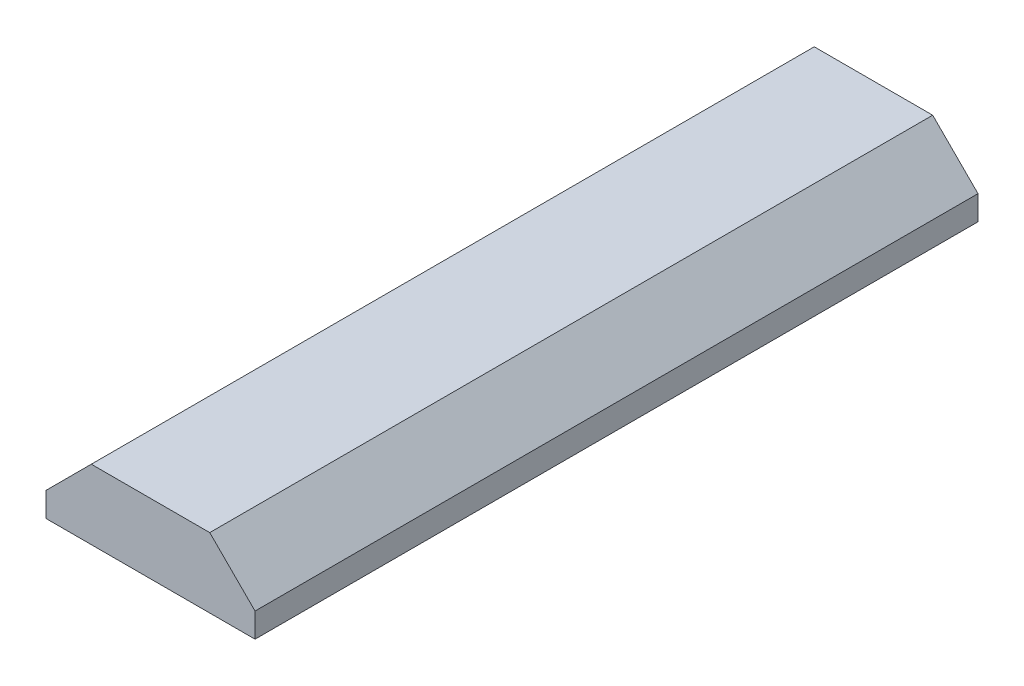
ISO-10303-21;
HEADER;
FILE_DESCRIPTION(('STEP AP214'),'2;1');
FILE_NAME('part.step','',(''),(''),'','','');
FILE_SCHEMA(('AUTOMOTIVE_DESIGN { 1 0 10303 214 1 1 1 1 }'));
ENDSEC;
DATA;
#1=APPLICATION_CONTEXT('core data for automotive mechanical design processes');
#2=APPLICATION_PROTOCOL_DEFINITION('international standard','automotive_design',2000,#1);
#3=PRODUCT_CONTEXT('',#1,'mechanical');
#4=PRODUCT('Part','Part','',(#3));
#5=PRODUCT_RELATED_PRODUCT_CATEGORY('part','',(#4));
#6=PRODUCT_DEFINITION_FORMATION('','',#4);
#7=PRODUCT_DEFINITION_CONTEXT('part definition',#1,'design');
#8=PRODUCT_DEFINITION('design','',#6,#7);
#9=PRODUCT_DEFINITION_SHAPE('','',#8);
#10=(LENGTH_UNIT() NAMED_UNIT(*) SI_UNIT(.MILLI.,.METRE.));
#11=(NAMED_UNIT(*) PLANE_ANGLE_UNIT() SI_UNIT($,.RADIAN.));
#12=(NAMED_UNIT(*) SI_UNIT($,.STERADIAN.) SOLID_ANGLE_UNIT());
#13=UNCERTAINTY_MEASURE_WITH_UNIT(LENGTH_MEASURE(1.E-05),#10,'distance_accuracy_value','');
#14=(GEOMETRIC_REPRESENTATION_CONTEXT(3) GLOBAL_UNCERTAINTY_ASSIGNED_CONTEXT((#13)) GLOBAL_UNIT_ASSIGNED_CONTEXT((#10,
#11,#12)) REPRESENTATION_CONTEXT('',''));
#15=CARTESIAN_POINT('',(0.,0.,0.));
#16=DIRECTION('',(0.,0.,1.));
#17=DIRECTION('',(1.,0.,0.));
#18=AXIS2_PLACEMENT_3D('',#15,#16,#17);
#19=CARTESIAN_POINT('',(3.4,1.80885878693797,41.5));
#20=DIRECTION('',(0.707106781186549,0.707106781186546,0.));
#21=DIRECTION('',(-0.707106781186546,0.707106781186549,0.));
#22=AXIS2_PLACEMENT_3D('',#19,#20,#21);
#23=PLANE('',#22);
#24=DIRECTION('',(0.707106781186546,-0.707106781186549,0.));
#25=VECTOR('',#24,1.);
#26=CARTESIAN_POINT('',(3.4,1.80885878693797,0.));
#27=LINE('',#26,#25);
#28=CARTESIAN_POINT('',(3.4,1.80885878693797,0.));
#29=VERTEX_POINT('',#28);
#30=CARTESIAN_POINT('',(6.,-0.791141213062042,0.));
#31=VERTEX_POINT('',#30);
#32=EDGE_CURVE('E127',#29,#31,#27,.T.);
#33=ORIENTED_EDGE('',*,*,#32,.F.);
#34=DIRECTION('',(0.,0.,-1.));
#35=VECTOR('',#34,1.);
#36=CARTESIAN_POINT('',(3.4,1.80885878693797,41.5));
#37=LINE('',#36,#35);
#38=CARTESIAN_POINT('',(3.4,1.80885878693797,41.5));
#39=VERTEX_POINT('',#38);
#40=EDGE_CURVE('E11',#39,#29,#37,.T.);
#41=ORIENTED_EDGE('',*,*,#40,.F.);
#42=DIRECTION('',(0.707106781186546,-0.707106781186549,0.));
#43=VECTOR('',#42,1.);
#44=CARTESIAN_POINT('',(3.4,1.80885878693797,41.5));
#45=LINE('',#44,#43);
#46=CARTESIAN_POINT('',(6.,-0.791141213062042,41.5));
#47=VERTEX_POINT('',#46);
#48=EDGE_CURVE('E139',#39,#47,#45,.T.);
#49=ORIENTED_EDGE('',*,*,#48,.T.);
#50=DIRECTION('',(0.,0.,-1.));
#51=VECTOR('',#50,1.);
#52=CARTESIAN_POINT('',(6.,-0.791141213062042,41.5));
#53=LINE('',#52,#51);
#54=EDGE_CURVE('E44',#47,#31,#53,.T.);
#55=ORIENTED_EDGE('',*,*,#54,.T.);
#56=EDGE_LOOP('',(#33,#41,#49,#55));
#57=FACE_BOUND('',#56,.T.);
#58=ADVANCED_FACE('F41',(#57),#23,.T.);
#59=CARTESIAN_POINT('',(3.4,1.80885878693797,41.5));
#60=DIRECTION('',(0.,-1.,0.));
#61=DIRECTION('',(0.,0.,-1.));
#62=AXIS2_PLACEMENT_3D('',#59,#60,#61);
#63=PLANE('',#62);
#64=DIRECTION('',(-1.,0.,0.));
#65=VECTOR('',#64,1.);
#66=CARTESIAN_POINT('',(3.4,1.80885878693797,0.));
#67=LINE('',#66,#65);
#68=CARTESIAN_POINT('',(-3.4,1.80885878693797,0.));
#69=VERTEX_POINT('',#68);
#70=EDGE_CURVE('E80',#29,#69,#67,.T.);
#71=ORIENTED_EDGE('',*,*,#70,.T.);
#72=DIRECTION('',(0.,0.,-1.));
#73=VECTOR('',#72,1.);
#74=CARTESIAN_POINT('',(-3.4,1.80885878693797,41.5));
#75=LINE('',#74,#73);
#76=CARTESIAN_POINT('',(-3.4,1.80885878693797,41.5));
#77=VERTEX_POINT('',#76);
#78=EDGE_CURVE('E50',#77,#69,#75,.T.);
#79=ORIENTED_EDGE('',*,*,#78,.F.);
#80=DIRECTION('',(-1.,0.,0.));
#81=VECTOR('',#80,1.);
#82=CARTESIAN_POINT('',(3.4,1.80885878693797,41.5));
#83=LINE('',#82,#81);
#84=EDGE_CURVE('E105',#39,#77,#83,.T.);
#85=ORIENTED_EDGE('',*,*,#84,.F.);
#86=ORIENTED_EDGE('',*,*,#40,.T.);
#87=EDGE_LOOP('',(#71,#79,#85,#86));
#88=FACE_BOUND('',#87,.T.);
#89=ADVANCED_FACE('F159',(#88),#63,.F.);
#90=CARTESIAN_POINT('',(-3.4,1.80885878693797,41.5));
#91=DIRECTION('',(0.707106781186549,-0.707106781186546,0.));
#92=DIRECTION('',(0.707106781186546,0.707106781186549,0.));
#93=AXIS2_PLACEMENT_3D('',#90,#91,#92);
#94=PLANE('',#93);
#95=DIRECTION('',(-0.707106781186546,-0.707106781186549,0.));
#96=VECTOR('',#95,1.);
#97=CARTESIAN_POINT('',(-3.4,1.80885878693797,0.));
#98=LINE('',#97,#96);
#99=CARTESIAN_POINT('',(-6.,-0.791141213062042,0.));
#100=VERTEX_POINT('',#99);
#101=EDGE_CURVE('E112',#69,#100,#98,.T.);
#102=ORIENTED_EDGE('',*,*,#101,.T.);
#103=DIRECTION('',(0.,0.,-1.));
#104=VECTOR('',#103,1.);
#105=CARTESIAN_POINT('',(-6.,-0.791141213062042,41.5));
#106=LINE('',#105,#104);
#107=CARTESIAN_POINT('',(-6.,-0.791141213062042,41.5));
#108=VERTEX_POINT('',#107);
#109=EDGE_CURVE('E109',#108,#100,#106,.T.);
#110=ORIENTED_EDGE('',*,*,#109,.F.);
#111=DIRECTION('',(-0.707106781186546,-0.707106781186549,0.));
#112=VECTOR('',#111,1.);
#113=CARTESIAN_POINT('',(-3.4,1.80885878693797,41.5));
#114=LINE('',#113,#112);
#115=EDGE_CURVE('E98',#77,#108,#114,.T.);
#116=ORIENTED_EDGE('',*,*,#115,.F.);
#117=ORIENTED_EDGE('',*,*,#78,.T.);
#118=EDGE_LOOP('',(#102,#110,#116,#117));
#119=FACE_BOUND('',#118,.T.);
#120=ADVANCED_FACE('F110',(#119),#94,.F.);
#121=CARTESIAN_POINT('',(-6.,-0.791141213062042,41.5));
#122=DIRECTION('',(1.,0.,0.));
#123=DIRECTION('',(0.,0.,-1.));
#124=AXIS2_PLACEMENT_3D('',#121,#122,#123);
#125=PLANE('',#124);
#126=DIRECTION('',(0.,-1.,0.));
#127=VECTOR('',#126,1.);
#128=CARTESIAN_POINT('',(-6.,-0.791141213062042,0.));
#129=LINE('',#128,#127);
#130=CARTESIAN_POINT('',(-6.,-2.19114121306203,0.));
#131=VERTEX_POINT('',#130);
#132=EDGE_CURVE('E136',#100,#131,#129,.T.);
#133=ORIENTED_EDGE('',*,*,#132,.T.);
#134=DIRECTION('',(0.,0.,-1.));
#135=VECTOR('',#134,1.);
#136=CARTESIAN_POINT('',(-6.,-2.19114121306203,41.5));
#137=LINE('',#136,#135);
#138=CARTESIAN_POINT('',(-6.,-2.19114121306203,41.5));
#139=VERTEX_POINT('',#138);
#140=EDGE_CURVE('E115',#139,#131,#137,.T.);
#141=ORIENTED_EDGE('',*,*,#140,.F.);
#142=DIRECTION('',(0.,-1.,0.));
#143=VECTOR('',#142,1.);
#144=CARTESIAN_POINT('',(-6.,-0.791141213062042,41.5));
#145=LINE('',#144,#143);
#146=EDGE_CURVE('E103',#108,#139,#145,.T.);
#147=ORIENTED_EDGE('',*,*,#146,.F.);
#148=ORIENTED_EDGE('',*,*,#109,.T.);
#149=EDGE_LOOP('',(#133,#141,#147,#148));
#150=FACE_BOUND('',#149,.T.);
#151=ADVANCED_FACE('F117',(#150),#125,.F.);
#152=CARTESIAN_POINT('',(-6.,-2.19114121306203,41.5));
#153=DIRECTION('',(0.,1.,0.));
#154=DIRECTION('',(0.,0.,1.));
#155=AXIS2_PLACEMENT_3D('',#152,#153,#154);
#156=PLANE('',#155);
#157=DIRECTION('',(1.,0.,0.));
#158=VECTOR('',#157,1.);
#159=CARTESIAN_POINT('',(-6.,-2.19114121306203,0.));
#160=LINE('',#159,#158);
#161=CARTESIAN_POINT('',(6.,-2.19114121306203,0.));
#162=VERTEX_POINT('',#161);
#163=EDGE_CURVE('E133',#131,#162,#160,.T.);
#164=ORIENTED_EDGE('',*,*,#163,.T.);
#165=DIRECTION('',(0.,0.,-1.));
#166=VECTOR('',#165,1.);
#167=CARTESIAN_POINT('',(6.,-2.19114121306203,41.5));
#168=LINE('',#167,#166);
#169=CARTESIAN_POINT('',(6.,-2.19114121306203,41.5));
#170=VERTEX_POINT('',#169);
#171=EDGE_CURVE('E142',#170,#162,#168,.T.);
#172=ORIENTED_EDGE('',*,*,#171,.F.);
#173=DIRECTION('',(1.,0.,0.));
#174=VECTOR('',#173,1.);
#175=CARTESIAN_POINT('',(-6.,-2.19114121306203,41.5));
#176=LINE('',#175,#174);
#177=EDGE_CURVE('E120',#139,#170,#176,.T.);
#178=ORIENTED_EDGE('',*,*,#177,.F.);
#179=ORIENTED_EDGE('',*,*,#140,.T.);
#180=EDGE_LOOP('',(#164,#172,#178,#179));
#181=FACE_BOUND('',#180,.T.);
#182=ADVANCED_FACE('F149',(#181),#156,.F.);
#183=CARTESIAN_POINT('',(6.,-0.791141213062042,41.5));
#184=DIRECTION('',(1.,0.,0.));
#185=DIRECTION('',(0.,0.,-1.));
#186=AXIS2_PLACEMENT_3D('',#183,#184,#185);
#187=PLANE('',#186);
#188=DIRECTION('',(0.,-1.,0.));
#189=VECTOR('',#188,1.);
#190=CARTESIAN_POINT('',(6.,-0.791141213062042,0.));
#191=LINE('',#190,#189);
#192=EDGE_CURVE('E130',#31,#162,#191,.T.);
#193=ORIENTED_EDGE('',*,*,#192,.F.);
#194=ORIENTED_EDGE('',*,*,#54,.F.);
#195=DIRECTION('',(0.,-1.,0.));
#196=VECTOR('',#195,1.);
#197=CARTESIAN_POINT('',(6.,-0.791141213062042,41.5));
#198=LINE('',#197,#196);
#199=EDGE_CURVE('E122',#47,#170,#198,.T.);
#200=ORIENTED_EDGE('',*,*,#199,.T.);
#201=ORIENTED_EDGE('',*,*,#171,.T.);
#202=EDGE_LOOP('',(#193,#194,#200,#201));
#203=FACE_BOUND('',#202,.T.);
#204=ADVANCED_FACE('F144',(#203),#187,.T.);
#205=CARTESIAN_POINT('',(0.,0.,41.5));
#206=DIRECTION('',(0.,0.,-1.));
#207=DIRECTION('',(-1.,0.,0.));
#208=AXIS2_PLACEMENT_3D('',#205,#206,#207);
#209=PLANE('',#208);
#210=ORIENTED_EDGE('',*,*,#48,.F.);
#211=ORIENTED_EDGE('',*,*,#84,.T.);
#212=ORIENTED_EDGE('',*,*,#115,.T.);
#213=ORIENTED_EDGE('',*,*,#146,.T.);
#214=ORIENTED_EDGE('',*,*,#177,.T.);
#215=ORIENTED_EDGE('',*,*,#199,.F.);
#216=EDGE_LOOP('',(#210,#211,#212,#213,#214,#215));
#217=FACE_BOUND('',#216,.T.);
#218=ADVANCED_FACE('F101',(#217),#209,.F.);
#219=CARTESIAN_POINT('',(0.,0.,0.));
#220=DIRECTION('',(0.,0.,-1.));
#221=DIRECTION('',(-1.,0.,0.));
#222=AXIS2_PLACEMENT_3D('',#219,#220,#221);
#223=PLANE('',#222);
#224=ORIENTED_EDGE('',*,*,#32,.T.);
#225=ORIENTED_EDGE('',*,*,#192,.T.);
#226=ORIENTED_EDGE('',*,*,#163,.F.);
#227=ORIENTED_EDGE('',*,*,#132,.F.);
#228=ORIENTED_EDGE('',*,*,#101,.F.);
#229=ORIENTED_EDGE('',*,*,#70,.F.);
#230=EDGE_LOOP('',(#224,#225,#226,#227,#228,#229));
#231=FACE_BOUND('',#230,.T.);
#232=ADVANCED_FACE('F147',(#231),#223,.T.);
#233=CLOSED_SHELL('',(#58,#89,#120,#151,#182,#204,#218,#232));
#234=MANIFOLD_SOLID_BREP('B2',#233);
#235=ADVANCED_BREP_SHAPE_REPRESENTATION('',(#18,#234),#14);
#236=SHAPE_DEFINITION_REPRESENTATION(#9,#235);
ENDSEC;
END-ISO-10303-21;
